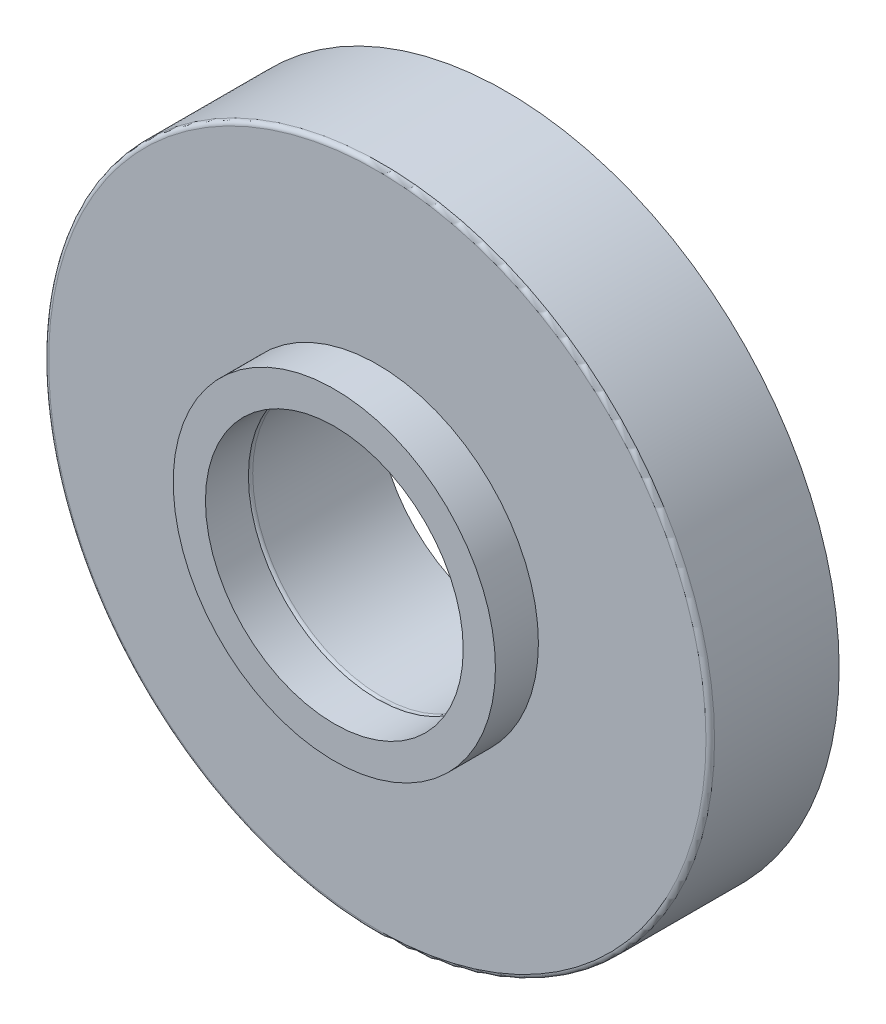
ISO-10303-21;
HEADER;
FILE_DESCRIPTION(('STEP AP214'),'2;1');
FILE_NAME('part.step','',(''),(''),'','','');
FILE_SCHEMA(('AUTOMOTIVE_DESIGN { 1 0 10303 214 1 1 1 1 }'));
ENDSEC;
DATA;
#1=APPLICATION_CONTEXT('core data for automotive mechanical design processes');
#2=APPLICATION_PROTOCOL_DEFINITION('international standard','automotive_design',2000,#1);
#3=PRODUCT_CONTEXT('',#1,'mechanical');
#4=PRODUCT('Part','Part','',(#3));
#5=PRODUCT_RELATED_PRODUCT_CATEGORY('part','',(#4));
#6=PRODUCT_DEFINITION_FORMATION('','',#4);
#7=PRODUCT_DEFINITION_CONTEXT('part definition',#1,'design');
#8=PRODUCT_DEFINITION('design','',#6,#7);
#9=PRODUCT_DEFINITION_SHAPE('','',#8);
#10=(LENGTH_UNIT() NAMED_UNIT(*) SI_UNIT(.MILLI.,.METRE.));
#11=(NAMED_UNIT(*) PLANE_ANGLE_UNIT() SI_UNIT($,.RADIAN.));
#12=(NAMED_UNIT(*) SI_UNIT($,.STERADIAN.) SOLID_ANGLE_UNIT());
#13=UNCERTAINTY_MEASURE_WITH_UNIT(LENGTH_MEASURE(1.E-05),#10,'distance_accuracy_value','');
#14=(GEOMETRIC_REPRESENTATION_CONTEXT(3) GLOBAL_UNCERTAINTY_ASSIGNED_CONTEXT((#13)) GLOBAL_UNIT_ASSIGNED_CONTEXT((#10,
#11,#12)) REPRESENTATION_CONTEXT('',''));
#15=CARTESIAN_POINT('',(0.,0.,0.));
#16=DIRECTION('',(0.,0.,1.));
#17=DIRECTION('',(1.,0.,0.));
#18=AXIS2_PLACEMENT_3D('',#15,#16,#17);
#19=CARTESIAN_POINT('',(0.,0.,4.));
#20=DIRECTION('',(0.,0.,-1.));
#21=DIRECTION('',(-1.,0.,0.));
#22=AXIS2_PLACEMENT_3D('',#19,#20,#21);
#23=CYLINDRICAL_SURFACE('',#22,3.75);
#24=CARTESIAN_POINT('',(0.,0.,4.));
#25=DIRECTION('',(0.,0.,1.));
#26=DIRECTION('',(1.,0.,0.));
#27=AXIS2_PLACEMENT_3D('',#24,#25,#26);
#28=CIRCLE('',#27,3.75);
#29=CARTESIAN_POINT('',(3.75,0.,4.));
#30=VERTEX_POINT('',#29);
#31=EDGE_CURVE('E11',#30,#30,#28,.T.);
#32=ORIENTED_EDGE('',*,*,#31,.F.);
#33=EDGE_LOOP('',(#32));
#34=FACE_BOUND('',#33,.T.);
#35=CARTESIAN_POINT('',(0.,0.,3.));
#36=DIRECTION('',(0.,0.,1.));
#37=DIRECTION('',(1.,0.,0.));
#38=AXIS2_PLACEMENT_3D('',#35,#36,#37);
#39=CIRCLE('',#38,3.75);
#40=CARTESIAN_POINT('',(3.75,0.,3.));
#41=VERTEX_POINT('',#40);
#42=EDGE_CURVE('E48',#41,#41,#39,.T.);
#43=ORIENTED_EDGE('',*,*,#42,.T.);
#44=EDGE_LOOP('',(#43));
#45=FACE_BOUND('',#44,.T.);
#46=ADVANCED_FACE('F41',(#34,#45),#23,.T.);
#47=CARTESIAN_POINT('',(0.,0.,4.));
#48=DIRECTION('',(0.,0.,1.));
#49=DIRECTION('',(1.,0.,0.));
#50=AXIS2_PLACEMENT_3D('',#47,#48,#49);
#51=PLANE('',#50);
#52=CARTESIAN_POINT('',(0.,0.,4.));
#53=DIRECTION('',(0.,0.,1.));
#54=DIRECTION('',(1.,0.,0.));
#55=AXIS2_PLACEMENT_3D('',#52,#53,#54);
#56=CIRCLE('',#55,3.);
#57=CARTESIAN_POINT('',(3.,0.,4.));
#58=VERTEX_POINT('',#57);
#59=EDGE_CURVE('E54',#58,#58,#56,.T.);
#60=ORIENTED_EDGE('',*,*,#59,.F.);
#61=EDGE_LOOP('',(#60));
#62=FACE_BOUND('',#61,.T.);
#63=ORIENTED_EDGE('',*,*,#31,.T.);
#64=EDGE_LOOP('',(#63));
#65=FACE_BOUND('',#64,.T.);
#66=ADVANCED_FACE('F70',(#62,#65),#51,.T.);
#67=CARTESIAN_POINT('',(0.,0.,3.));
#68=DIRECTION('',(0.,0.,1.));
#69=DIRECTION('',(1.,0.,0.));
#70=AXIS2_PLACEMENT_3D('',#67,#68,#69);
#71=PLANE('',#70);
#72=CARTESIAN_POINT('',(0.,0.,3.));
#73=DIRECTION('',(0.,0.,1.));
#74=DIRECTION('',(1.,0.,0.));
#75=AXIS2_PLACEMENT_3D('',#72,#73,#74);
#76=CIRCLE('',#75,3.);
#77=CARTESIAN_POINT('',(3.,0.,3.));
#78=VERTEX_POINT('',#77);
#79=EDGE_CURVE('E44',#78,#78,#76,.T.);
#80=ORIENTED_EDGE('',*,*,#79,.T.);
#81=EDGE_LOOP('',(#80));
#82=FACE_BOUND('',#81,.T.);
#83=ORIENTED_EDGE('',*,*,#42,.F.);
#84=EDGE_LOOP('',(#83));
#85=FACE_BOUND('',#84,.T.);
#86=ADVANCED_FACE('F61',(#82,#85),#71,.F.);
#87=CARTESIAN_POINT('',(0.,0.,0.));
#88=DIRECTION('',(0.,0.,1.));
#89=DIRECTION('',(1.,0.,0.));
#90=AXIS2_PLACEMENT_3D('',#87,#88,#89);
#91=CYLINDRICAL_SURFACE('',#90,3.);
#92=ORIENTED_EDGE('',*,*,#59,.T.);
#93=EDGE_LOOP('',(#92));
#94=FACE_BOUND('',#93,.T.);
#95=ORIENTED_EDGE('',*,*,#79,.F.);
#96=EDGE_LOOP('',(#95));
#97=FACE_BOUND('',#96,.T.);
#98=ADVANCED_FACE('F64',(#94,#97),#91,.F.);
#99=CLOSED_SHELL('',(#46,#66,#86,#98));
#100=MANIFOLD_SOLID_BREP('B2',#99);
#101=CARTESIAN_POINT('',(0.,0.,3.));
#102=DIRECTION('',(0.,0.,-1.));
#103=DIRECTION('',(-1.,0.,0.));
#104=AXIS2_PLACEMENT_3D('',#101,#102,#103);
#105=CYLINDRICAL_SURFACE('',#104,7.75);
#106=CARTESIAN_POINT('',(0.,0.,2.9));
#107=DIRECTION('',(0.,0.,1.));
#108=DIRECTION('',(1.,0.,0.));
#109=AXIS2_PLACEMENT_3D('',#106,#107,#108);
#110=CIRCLE('',#109,7.75);
#111=CARTESIAN_POINT('',(7.75,0.,2.9));
#112=VERTEX_POINT('',#111);
#113=EDGE_CURVE('E110',#112,#112,#110,.F.);
#114=ORIENTED_EDGE('',*,*,#113,.T.);
#115=EDGE_LOOP('',(#114));
#116=FACE_BOUND('',#115,.T.);
#117=CARTESIAN_POINT('',(0.,0.,0.));
#118=DIRECTION('',(0.,0.,1.));
#119=DIRECTION('',(1.,0.,0.));
#120=AXIS2_PLACEMENT_3D('',#117,#118,#119);
#121=CIRCLE('',#120,7.75);
#122=CARTESIAN_POINT('',(7.75,0.,0.));
#123=VERTEX_POINT('',#122);
#124=EDGE_CURVE('E123',#123,#123,#121,.T.);
#125=ORIENTED_EDGE('',*,*,#124,.T.);
#126=EDGE_LOOP('',(#125));
#127=FACE_BOUND('',#126,.T.);
#128=ADVANCED_FACE('F103',(#116,#127),#105,.T.);
#129=CARTESIAN_POINT('',(0.,0.,3.));
#130=DIRECTION('',(0.,0.,1.));
#131=DIRECTION('',(1.,0.,0.));
#132=AXIS2_PLACEMENT_3D('',#129,#130,#131);
#133=PLANE('',#132);
#134=CARTESIAN_POINT('',(0.,0.,3.));
#135=DIRECTION('',(0.,0.,1.));
#136=DIRECTION('',(1.,0.,0.));
#137=AXIS2_PLACEMENT_3D('',#134,#135,#136);
#138=CIRCLE('',#137,7.65);
#139=CARTESIAN_POINT('',(7.65,0.,3.));
#140=VERTEX_POINT('',#139);
#141=EDGE_CURVE('E114',#140,#140,#138,.T.);
#142=ORIENTED_EDGE('',*,*,#141,.T.);
#143=EDGE_LOOP('',(#142));
#144=FACE_BOUND('',#143,.T.);
#145=CARTESIAN_POINT('',(0.,0.,3.));
#146=DIRECTION('',(0.,0.,1.));
#147=DIRECTION('',(1.,0.,0.));
#148=AXIS2_PLACEMENT_3D('',#145,#146,#147);
#149=CIRCLE('',#148,3.1);
#150=CARTESIAN_POINT('',(3.1,0.,3.));
#151=VERTEX_POINT('',#150);
#152=EDGE_CURVE('E118',#151,#151,#149,.F.);
#153=ORIENTED_EDGE('',*,*,#152,.T.);
#154=EDGE_LOOP('',(#153));
#155=FACE_BOUND('',#154,.T.);
#156=ADVANCED_FACE('F142',(#144,#155),#133,.T.);
#157=CARTESIAN_POINT('',(0.,0.,0.));
#158=DIRECTION('',(0.,0.,1.));
#159=DIRECTION('',(1.,0.,0.));
#160=AXIS2_PLACEMENT_3D('',#157,#158,#159);
#161=PLANE('',#160);
#162=CARTESIAN_POINT('',(0.,0.,0.));
#163=DIRECTION('',(0.,0.,1.));
#164=DIRECTION('',(1.,0.,0.));
#165=AXIS2_PLACEMENT_3D('',#162,#163,#164);
#166=CIRCLE('',#165,3.);
#167=CARTESIAN_POINT('',(3.,0.,0.));
#168=VERTEX_POINT('',#167);
#169=EDGE_CURVE('E126',#168,#168,#166,.T.);
#170=ORIENTED_EDGE('',*,*,#169,.T.);
#171=EDGE_LOOP('',(#170));
#172=FACE_BOUND('',#171,.T.);
#173=ORIENTED_EDGE('',*,*,#124,.F.);
#174=EDGE_LOOP('',(#173));
#175=FACE_BOUND('',#174,.T.);
#176=ADVANCED_FACE('F130',(#172,#175),#161,.F.);
#177=CARTESIAN_POINT('',(0.,0.,0.));
#178=DIRECTION('',(0.,0.,1.));
#179=DIRECTION('',(1.,0.,0.));
#180=AXIS2_PLACEMENT_3D('',#177,#178,#179);
#181=CYLINDRICAL_SURFACE('',#180,3.);
#182=CARTESIAN_POINT('',(0.,0.,2.9));
#183=DIRECTION('',(0.,0.,1.));
#184=DIRECTION('',(1.,0.,0.));
#185=AXIS2_PLACEMENT_3D('',#182,#183,#184);
#186=CIRCLE('',#185,3.);
#187=CARTESIAN_POINT('',(3.,0.,2.9));
#188=VERTEX_POINT('',#187);
#189=EDGE_CURVE('E40',#188,#188,#186,.T.);
#190=ORIENTED_EDGE('',*,*,#189,.T.);
#191=EDGE_LOOP('',(#190));
#192=FACE_BOUND('',#191,.T.);
#193=ORIENTED_EDGE('',*,*,#169,.F.);
#194=EDGE_LOOP('',(#193));
#195=FACE_BOUND('',#194,.T.);
#196=ADVANCED_FACE('F133',(#192,#195),#181,.F.);
#197=CARTESIAN_POINT('',(0.,0.,2.9));
#198=DIRECTION('',(0.,0.,1.));
#199=DIRECTION('',(1.,0.,0.));
#200=AXIS2_PLACEMENT_3D('',#197,#198,#199);
#201=TOROIDAL_SURFACE('',#200,7.65,0.1);
#202=ORIENTED_EDGE('',*,*,#113,.F.);
#203=EDGE_LOOP('',(#202));
#204=FACE_BOUND('',#203,.T.);
#205=ORIENTED_EDGE('',*,*,#141,.F.);
#206=EDGE_LOOP('',(#205));
#207=FACE_BOUND('',#206,.T.);
#208=ADVANCED_FACE('F135',(#204,#207),#201,.T.);
#209=CARTESIAN_POINT('',(0.,0.,2.9));
#210=DIRECTION('',(0.,0.,1.));
#211=DIRECTION('',(1.,0.,0.));
#212=AXIS2_PLACEMENT_3D('',#209,#210,#211);
#213=TOROIDAL_SURFACE('',#212,3.1,0.1);
#214=ORIENTED_EDGE('',*,*,#152,.F.);
#215=EDGE_LOOP('',(#214));
#216=FACE_BOUND('',#215,.T.);
#217=ORIENTED_EDGE('',*,*,#189,.F.);
#218=EDGE_LOOP('',(#217));
#219=FACE_BOUND('',#218,.T.);
#220=ADVANCED_FACE('F105',(#216,#219),#213,.T.);
#221=CLOSED_SHELL('',(#128,#156,#176,#196,#208,#220));
#222=MANIFOLD_SOLID_BREP('B6',#221);
#223=ADVANCED_BREP_SHAPE_REPRESENTATION('',(#18,#100,#222),#14);
#224=SHAPE_DEFINITION_REPRESENTATION(#9,#223);
ENDSEC;
END-ISO-10303-21;
